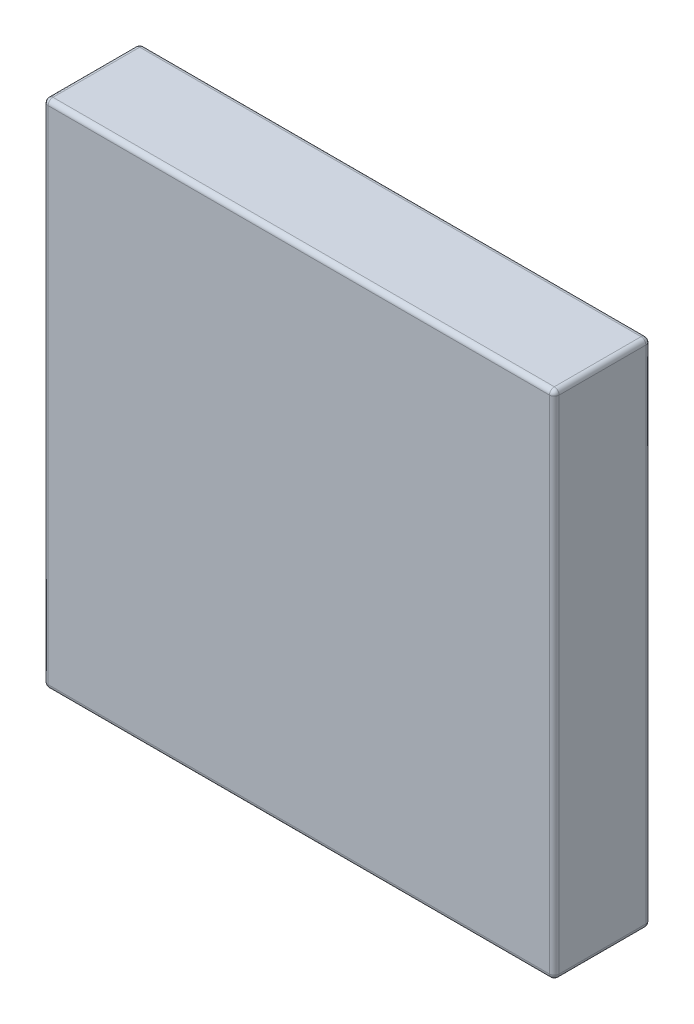
ISO-10303-21;
HEADER;
FILE_DESCRIPTION(('STEP AP214'),'2;1');
FILE_NAME('part.step','',(''),(''),'','','');
FILE_SCHEMA(('AUTOMOTIVE_DESIGN { 1 0 10303 214 1 1 1 1 }'));
ENDSEC;
DATA;
#1=APPLICATION_CONTEXT('core data for automotive mechanical design processes');
#2=APPLICATION_PROTOCOL_DEFINITION('international standard','automotive_design',2000,#1);
#3=PRODUCT_CONTEXT('',#1,'mechanical');
#4=PRODUCT('Part','Part','',(#3));
#5=PRODUCT_RELATED_PRODUCT_CATEGORY('part','',(#4));
#6=PRODUCT_DEFINITION_FORMATION('','',#4);
#7=PRODUCT_DEFINITION_CONTEXT('part definition',#1,'design');
#8=PRODUCT_DEFINITION('design','',#6,#7);
#9=PRODUCT_DEFINITION_SHAPE('','',#8);
#10=(LENGTH_UNIT() NAMED_UNIT(*) SI_UNIT(.MILLI.,.METRE.));
#11=(NAMED_UNIT(*) PLANE_ANGLE_UNIT() SI_UNIT($,.RADIAN.));
#12=(NAMED_UNIT(*) SI_UNIT($,.STERADIAN.) SOLID_ANGLE_UNIT());
#13=UNCERTAINTY_MEASURE_WITH_UNIT(LENGTH_MEASURE(1.E-05),#10,'distance_accuracy_value','');
#14=(GEOMETRIC_REPRESENTATION_CONTEXT(3) GLOBAL_UNCERTAINTY_ASSIGNED_CONTEXT((#13)) GLOBAL_UNIT_ASSIGNED_CONTEXT((#10,
#11,#12)) REPRESENTATION_CONTEXT('',''));
#15=CARTESIAN_POINT('',(0.,0.,0.));
#16=DIRECTION('',(0.,0.,1.));
#17=DIRECTION('',(1.,0.,0.));
#18=AXIS2_PLACEMENT_3D('',#15,#16,#17);
#19=CARTESIAN_POINT('',(53.0330085889911,0.,10.));
#20=DIRECTION('',(0.,1.,0.));
#21=DIRECTION('',(0.,0.,1.));
#22=AXIS2_PLACEMENT_3D('',#19,#20,#21);
#23=PLANE('',#22);
#24=DIRECTION('',(1.,0.,0.));
#25=VECTOR('',#24,1.);
#26=CARTESIAN_POINT('',(53.0330085889911,0.,9.5));
#27=LINE('',#26,#25);
#28=CARTESIAN_POINT('',(52.5330085889911,0.,9.5));
#29=VERTEX_POINT('',#28);
#30=CARTESIAN_POINT('',(0.5,0.,9.5));
#31=VERTEX_POINT('',#30);
#32=EDGE_CURVE('E134',#29,#31,#27,.F.);
#33=ORIENTED_EDGE('',*,*,#32,.T.);
#34=DIRECTION('',(0.,0.,-1.));
#35=VECTOR('',#34,1.);
#36=CARTESIAN_POINT('',(0.5,0.,10.));
#37=LINE('',#36,#35);
#38=CARTESIAN_POINT('',(0.5,0.,0.5));
#39=VERTEX_POINT('',#38);
#40=EDGE_CURVE('E130',#31,#39,#37,.T.);
#41=ORIENTED_EDGE('',*,*,#40,.T.);
#42=DIRECTION('',(1.,0.,0.));
#43=VECTOR('',#42,1.);
#44=CARTESIAN_POINT('',(53.0330085889911,0.,0.5));
#45=LINE('',#44,#43);
#46=CARTESIAN_POINT('',(52.5330085889911,0.,0.5));
#47=VERTEX_POINT('',#46);
#48=EDGE_CURVE('E125',#39,#47,#45,.T.);
#49=ORIENTED_EDGE('',*,*,#48,.T.);
#50=DIRECTION('',(0.,0.,-1.));
#51=VECTOR('',#50,1.);
#52=CARTESIAN_POINT('',(52.5330085889911,0.,10.));
#53=LINE('',#52,#51);
#54=EDGE_CURVE('E127',#47,#29,#53,.F.);
#55=ORIENTED_EDGE('',*,*,#54,.T.);
#56=EDGE_LOOP('',(#33,#41,#49,#55));
#57=FACE_BOUND('',#56,.T.);
#58=ADVANCED_FACE('F33',(#57),#23,.F.);
#59=CARTESIAN_POINT('',(53.033008588991,53.0330085889911,10.));
#60=DIRECTION('',(-1.,0.,0.));
#61=DIRECTION('',(0.,-1.,0.));
#62=AXIS2_PLACEMENT_3D('',#59,#60,#61);
#63=PLANE('',#62);
#64=DIRECTION('',(0.,1.,0.));
#65=VECTOR('',#64,1.);
#66=CARTESIAN_POINT('',(53.033008588991,53.0330085889911,0.5));
#67=LINE('',#66,#65);
#68=CARTESIAN_POINT('',(53.0330085889911,0.500000000000001,0.5));
#69=VERTEX_POINT('',#68);
#70=CARTESIAN_POINT('',(53.033008588991,52.5330085889911,0.5));
#71=VERTEX_POINT('',#70);
#72=EDGE_CURVE('E273',#69,#71,#67,.T.);
#73=ORIENTED_EDGE('',*,*,#72,.T.);
#74=DIRECTION('',(0.,0.,-1.));
#75=VECTOR('',#74,1.);
#76=CARTESIAN_POINT('',(53.033008588991,52.5330085889911,10.));
#77=LINE('',#76,#75);
#78=CARTESIAN_POINT('',(53.033008588991,52.5330085889911,9.5));
#79=VERTEX_POINT('',#78);
#80=EDGE_CURVE('E276',#71,#79,#77,.F.);
#81=ORIENTED_EDGE('',*,*,#80,.T.);
#82=DIRECTION('',(0.,1.,0.));
#83=VECTOR('',#82,1.);
#84=CARTESIAN_POINT('',(53.033008588991,53.0330085889911,9.5));
#85=LINE('',#84,#83);
#86=CARTESIAN_POINT('',(53.0330085889911,0.500000000000001,9.5));
#87=VERTEX_POINT('',#86);
#88=EDGE_CURVE('E271',#79,#87,#85,.F.);
#89=ORIENTED_EDGE('',*,*,#88,.T.);
#90=DIRECTION('',(0.,0.,-1.));
#91=VECTOR('',#90,1.);
#92=CARTESIAN_POINT('',(53.0330085889911,0.5,10.));
#93=LINE('',#92,#91);
#94=EDGE_CURVE('E269',#87,#69,#93,.T.);
#95=ORIENTED_EDGE('',*,*,#94,.T.);
#96=EDGE_LOOP('',(#73,#81,#89,#95));
#97=FACE_BOUND('',#96,.T.);
#98=ADVANCED_FACE('F309',(#97),#63,.F.);
#99=CARTESIAN_POINT('',(53.033008588991,53.0330085889911,10.));
#100=DIRECTION('',(0.,-1.,0.));
#101=DIRECTION('',(1.,0.,0.));
#102=AXIS2_PLACEMENT_3D('',#99,#100,#101);
#103=PLANE('',#102);
#104=DIRECTION('',(-1.,0.,0.));
#105=VECTOR('',#104,1.);
#106=CARTESIAN_POINT('',(0.,53.0330085889911,0.5));
#107=LINE('',#106,#105);
#108=CARTESIAN_POINT('',(52.533008588991,53.0330085889911,0.5));
#109=VERTEX_POINT('',#108);
#110=CARTESIAN_POINT('',(0.5,53.0330085889911,0.5));
#111=VERTEX_POINT('',#110);
#112=EDGE_CURVE('E281',#109,#111,#107,.T.);
#113=ORIENTED_EDGE('',*,*,#112,.T.);
#114=DIRECTION('',(0.,0.,-1.));
#115=VECTOR('',#114,1.);
#116=CARTESIAN_POINT('',(0.5,53.0330085889911,10.));
#117=LINE('',#116,#115);
#118=CARTESIAN_POINT('',(0.5,53.0330085889911,9.5));
#119=VERTEX_POINT('',#118);
#120=EDGE_CURVE('E218',#111,#119,#117,.F.);
#121=ORIENTED_EDGE('',*,*,#120,.T.);
#122=DIRECTION('',(-1.,0.,0.));
#123=VECTOR('',#122,1.);
#124=CARTESIAN_POINT('',(53.033008588991,53.0330085889911,9.5));
#125=LINE('',#124,#123);
#126=CARTESIAN_POINT('',(52.533008588991,53.0330085889911,9.5));
#127=VERTEX_POINT('',#126);
#128=EDGE_CURVE('E211',#119,#127,#125,.F.);
#129=ORIENTED_EDGE('',*,*,#128,.T.);
#130=DIRECTION('',(0.,0.,-1.));
#131=VECTOR('',#130,1.);
#132=CARTESIAN_POINT('',(52.533008588991,53.0330085889911,10.));
#133=LINE('',#132,#131);
#134=EDGE_CURVE('E278',#127,#109,#133,.T.);
#135=ORIENTED_EDGE('',*,*,#134,.T.);
#136=EDGE_LOOP('',(#113,#121,#129,#135));
#137=FACE_BOUND('',#136,.T.);
#138=ADVANCED_FACE('F285',(#137),#103,.F.);
#139=CARTESIAN_POINT('',(0.,0.,10.));
#140=DIRECTION('',(1.,0.,0.));
#141=DIRECTION('',(0.,0.,-1.));
#142=AXIS2_PLACEMENT_3D('',#139,#140,#141);
#143=PLANE('',#142);
#144=DIRECTION('',(0.,-1.,0.));
#145=VECTOR('',#144,1.);
#146=CARTESIAN_POINT('',(0.,0.,0.5));
#147=LINE('',#146,#145);
#148=CARTESIAN_POINT('',(0.,52.5330085889911,0.5));
#149=VERTEX_POINT('',#148);
#150=CARTESIAN_POINT('',(0.,0.5,0.5));
#151=VERTEX_POINT('',#150);
#152=EDGE_CURVE('E248',#149,#151,#147,.T.);
#153=ORIENTED_EDGE('',*,*,#152,.T.);
#154=DIRECTION('',(0.,0.,-1.));
#155=VECTOR('',#154,1.);
#156=CARTESIAN_POINT('',(0.,0.5,10.));
#157=LINE('',#156,#155);
#158=CARTESIAN_POINT('',(0.,0.5,9.5));
#159=VERTEX_POINT('',#158);
#160=EDGE_CURVE('E252',#151,#159,#157,.F.);
#161=ORIENTED_EDGE('',*,*,#160,.T.);
#162=DIRECTION('',(0.,-1.,0.));
#163=VECTOR('',#162,1.);
#164=CARTESIAN_POINT('',(0.,0.,9.5));
#165=LINE('',#164,#163);
#166=CARTESIAN_POINT('',(0.,52.5330085889911,9.5));
#167=VERTEX_POINT('',#166);
#168=EDGE_CURVE('E243',#159,#167,#165,.F.);
#169=ORIENTED_EDGE('',*,*,#168,.T.);
#170=DIRECTION('',(0.,0.,-1.));
#171=VECTOR('',#170,1.);
#172=CARTESIAN_POINT('',(0.,52.5330085889911,10.));
#173=LINE('',#172,#171);
#174=EDGE_CURVE('E249',#167,#149,#173,.T.);
#175=ORIENTED_EDGE('',*,*,#174,.T.);
#176=EDGE_LOOP('',(#153,#161,#169,#175));
#177=FACE_BOUND('',#176,.T.);
#178=ADVANCED_FACE('F253',(#177),#143,.F.);
#179=CARTESIAN_POINT('',(0.,0.,10.));
#180=DIRECTION('',(0.,0.,-1.));
#181=DIRECTION('',(-1.,0.,0.));
#182=AXIS2_PLACEMENT_3D('',#179,#180,#181);
#183=PLANE('',#182);
#184=DIRECTION('',(0.,-1.,0.));
#185=VECTOR('',#184,1.);
#186=CARTESIAN_POINT('',(0.5,0.,10.));
#187=LINE('',#186,#185);
#188=CARTESIAN_POINT('',(0.5,52.5330085889911,10.));
#189=VERTEX_POINT('',#188);
#190=CARTESIAN_POINT('',(0.5,0.5,10.));
#191=VERTEX_POINT('',#190);
#192=EDGE_CURVE('E215',#189,#191,#187,.T.);
#193=ORIENTED_EDGE('',*,*,#192,.T.);
#194=DIRECTION('',(1.,0.,0.));
#195=VECTOR('',#194,1.);
#196=CARTESIAN_POINT('',(0.,0.5,10.));
#197=LINE('',#196,#195);
#198=CARTESIAN_POINT('',(52.5330085889911,0.5,10.));
#199=VERTEX_POINT('',#198);
#200=EDGE_CURVE('E11',#191,#199,#197,.T.);
#201=ORIENTED_EDGE('',*,*,#200,.T.);
#202=DIRECTION('',(0.,1.,0.));
#203=VECTOR('',#202,1.);
#204=CARTESIAN_POINT('',(52.5330085889911,0.,10.));
#205=LINE('',#204,#203);
#206=CARTESIAN_POINT('',(52.533008588991,52.5330085889911,10.));
#207=VERTEX_POINT('',#206);
#208=EDGE_CURVE('E42',#199,#207,#205,.T.);
#209=ORIENTED_EDGE('',*,*,#208,.T.);
#210=DIRECTION('',(-1.,0.,0.));
#211=VECTOR('',#210,1.);
#212=CARTESIAN_POINT('',(0.,52.5330085889911,10.));
#213=LINE('',#212,#211);
#214=EDGE_CURVE('E213',#207,#189,#213,.T.);
#215=ORIENTED_EDGE('',*,*,#214,.T.);
#216=EDGE_LOOP('',(#193,#201,#209,#215));
#217=FACE_BOUND('',#216,.T.);
#218=ADVANCED_FACE('F293',(#217),#183,.F.);
#219=CARTESIAN_POINT('',(0.,0.,0.));
#220=DIRECTION('',(0.,0.,-1.));
#221=DIRECTION('',(-1.,0.,0.));
#222=AXIS2_PLACEMENT_3D('',#219,#220,#221);
#223=PLANE('',#222);
#224=DIRECTION('',(1.,0.,0.));
#225=VECTOR('',#224,1.);
#226=CARTESIAN_POINT('',(0.,0.5,0.));
#227=LINE('',#226,#225);
#228=CARTESIAN_POINT('',(52.5330085889911,0.5,0.));
#229=VERTEX_POINT('',#228);
#230=CARTESIAN_POINT('',(0.5,0.5,0.));
#231=VERTEX_POINT('',#230);
#232=EDGE_CURVE('E155',#229,#231,#227,.F.);
#233=ORIENTED_EDGE('',*,*,#232,.T.);
#234=DIRECTION('',(0.,-1.,0.));
#235=VECTOR('',#234,1.);
#236=CARTESIAN_POINT('',(0.5,53.0330085889911,0.));
#237=LINE('',#236,#235);
#238=CARTESIAN_POINT('',(0.5,52.5330085889911,0.));
#239=VERTEX_POINT('',#238);
#240=EDGE_CURVE('E266',#231,#239,#237,.F.);
#241=ORIENTED_EDGE('',*,*,#240,.T.);
#242=DIRECTION('',(-1.,0.,0.));
#243=VECTOR('',#242,1.);
#244=CARTESIAN_POINT('',(53.033008588991,52.5330085889911,0.));
#245=LINE('',#244,#243);
#246=CARTESIAN_POINT('',(52.533008588991,52.5330085889911,0.));
#247=VERTEX_POINT('',#246);
#248=EDGE_CURVE('E258',#239,#247,#245,.F.);
#249=ORIENTED_EDGE('',*,*,#248,.T.);
#250=DIRECTION('',(0.,1.,0.));
#251=VECTOR('',#250,1.);
#252=CARTESIAN_POINT('',(52.5330085889911,0.,0.));
#253=LINE('',#252,#251);
#254=EDGE_CURVE('E260',#247,#229,#253,.F.);
#255=ORIENTED_EDGE('',*,*,#254,.T.);
#256=EDGE_LOOP('',(#233,#241,#249,#255));
#257=FACE_BOUND('',#256,.T.);
#258=ADVANCED_FACE('F338',(#257),#223,.T.);
#259=CARTESIAN_POINT('',(52.533008588991,52.5330085889911,10.));
#260=DIRECTION('',(0.,0.,-1.));
#261=DIRECTION('',(-1.,0.,0.));
#262=AXIS2_PLACEMENT_3D('',#259,#260,#261);
#263=CYLINDRICAL_SURFACE('',#262,0.5);
#264=CARTESIAN_POINT('',(52.533008588991,52.5330085889911,9.5));
#265=DIRECTION('',(0.,0.,1.));
#266=DIRECTION('',(1.,0.,0.));
#267=AXIS2_PLACEMENT_3D('',#264,#265,#266);
#268=CIRCLE('',#267,0.5);
#269=EDGE_CURVE('E37',#79,#127,#268,.T.);
#270=ORIENTED_EDGE('',*,*,#269,.F.);
#271=ORIENTED_EDGE('',*,*,#80,.F.);
#272=CARTESIAN_POINT('',(52.533008588991,52.5330085889911,0.5));
#273=DIRECTION('',(0.,0.,-1.));
#274=DIRECTION('',(-1.,0.,0.));
#275=AXIS2_PLACEMENT_3D('',#272,#273,#274);
#276=CIRCLE('',#275,0.5);
#277=EDGE_CURVE('E190',#109,#71,#276,.T.);
#278=ORIENTED_EDGE('',*,*,#277,.F.);
#279=ORIENTED_EDGE('',*,*,#134,.F.);
#280=EDGE_LOOP('',(#270,#271,#278,#279));
#281=FACE_BOUND('',#280,.T.);
#282=ADVANCED_FACE('F35',(#281),#263,.T.);
#283=CARTESIAN_POINT('',(52.533008588991,52.5330085889911,9.5));
#284=DIRECTION('',(0.,0.,1.));
#285=DIRECTION('',(1.,0.,0.));
#286=AXIS2_PLACEMENT_3D('',#283,#284,#285);
#287=SPHERICAL_SURFACE('',#286,0.5);
#288=CARTESIAN_POINT('',(52.533008588991,52.5330085889911,9.5));
#289=DIRECTION('',(0.,1.,0.));
#290=DIRECTION('',(0.,0.,1.));
#291=AXIS2_PLACEMENT_3D('',#288,#289,#290);
#292=CIRCLE('',#291,0.5);
#293=EDGE_CURVE('E186',#79,#207,#292,.F.);
#294=ORIENTED_EDGE('',*,*,#293,.F.);
#295=ORIENTED_EDGE('',*,*,#269,.T.);
#296=CARTESIAN_POINT('',(52.533008588991,52.5330085889911,9.5));
#297=DIRECTION('',(1.,0.,0.));
#298=DIRECTION('',(0.,0.,-1.));
#299=AXIS2_PLACEMENT_3D('',#296,#297,#298);
#300=CIRCLE('',#299,0.5);
#301=EDGE_CURVE('E188',#207,#127,#300,.F.);
#302=ORIENTED_EDGE('',*,*,#301,.F.);
#303=EDGE_LOOP('',(#294,#295,#302));
#304=FACE_BOUND('',#303,.T.);
#305=ADVANCED_FACE('F202',(#304),#287,.T.);
#306=CARTESIAN_POINT('',(52.533008588991,52.5330085889911,0.5));
#307=DIRECTION('',(0.,0.,1.));
#308=DIRECTION('',(1.,0.,0.));
#309=AXIS2_PLACEMENT_3D('',#306,#307,#308);
#310=SPHERICAL_SURFACE('',#309,0.5);
#311=CARTESIAN_POINT('',(52.533008588991,52.5330085889911,0.5));
#312=DIRECTION('',(1.,0.,0.));
#313=DIRECTION('',(0.,0.,-1.));
#314=AXIS2_PLACEMENT_3D('',#311,#312,#313);
#315=CIRCLE('',#314,0.5);
#316=EDGE_CURVE('E181',#109,#247,#315,.F.);
#317=ORIENTED_EDGE('',*,*,#316,.F.);
#318=ORIENTED_EDGE('',*,*,#277,.T.);
#319=CARTESIAN_POINT('',(52.533008588991,52.5330085889911,0.5));
#320=DIRECTION('',(0.,1.,0.));
#321=DIRECTION('',(0.,0.,1.));
#322=AXIS2_PLACEMENT_3D('',#319,#320,#321);
#323=CIRCLE('',#322,0.5);
#324=EDGE_CURVE('E184',#247,#71,#323,.F.);
#325=ORIENTED_EDGE('',*,*,#324,.F.);
#326=EDGE_LOOP('',(#317,#318,#325));
#327=FACE_BOUND('',#326,.T.);
#328=ADVANCED_FACE('F370',(#327),#310,.T.);
#329=CARTESIAN_POINT('',(0.,52.5330085889911,9.5));
#330=DIRECTION('',(-1.,0.,0.));
#331=DIRECTION('',(0.,-1.,0.));
#332=AXIS2_PLACEMENT_3D('',#329,#330,#331);
#333=CYLINDRICAL_SURFACE('',#332,0.5);
#334=ORIENTED_EDGE('',*,*,#301,.T.);
#335=ORIENTED_EDGE('',*,*,#128,.F.);
#336=CARTESIAN_POINT('',(0.5,52.5330085889911,9.5));
#337=DIRECTION('',(-1.,0.,0.));
#338=DIRECTION('',(0.,-1.,0.));
#339=AXIS2_PLACEMENT_3D('',#336,#337,#338);
#340=CIRCLE('',#339,0.5);
#341=EDGE_CURVE('E175',#189,#119,#340,.T.);
#342=ORIENTED_EDGE('',*,*,#341,.F.);
#343=ORIENTED_EDGE('',*,*,#214,.F.);
#344=EDGE_LOOP('',(#334,#335,#342,#343));
#345=FACE_BOUND('',#344,.T.);
#346=ADVANCED_FACE('F209',(#345),#333,.T.);
#347=CARTESIAN_POINT('',(52.5330085889911,0.,9.5));
#348=DIRECTION('',(0.,1.,0.));
#349=DIRECTION('',(-1.,0.,0.));
#350=AXIS2_PLACEMENT_3D('',#347,#348,#349);
#351=CYLINDRICAL_SURFACE('',#350,0.5);
#352=ORIENTED_EDGE('',*,*,#293,.T.);
#353=ORIENTED_EDGE('',*,*,#208,.F.);
#354=CARTESIAN_POINT('',(52.5330085889911,0.5,9.5));
#355=DIRECTION('',(0.,-1.,0.));
#356=DIRECTION('',(0.,0.,-1.));
#357=AXIS2_PLACEMENT_3D('',#354,#355,#356);
#358=CIRCLE('',#357,0.5);
#359=EDGE_CURVE('E173',#87,#199,#358,.T.);
#360=ORIENTED_EDGE('',*,*,#359,.F.);
#361=ORIENTED_EDGE('',*,*,#88,.F.);
#362=EDGE_LOOP('',(#352,#353,#360,#361));
#363=FACE_BOUND('',#362,.T.);
#364=ADVANCED_FACE('F345',(#363),#351,.T.);
#365=CARTESIAN_POINT('',(52.5330085889911,0.5,10.));
#366=DIRECTION('',(0.,0.,-1.));
#367=DIRECTION('',(-1.,0.,0.));
#368=AXIS2_PLACEMENT_3D('',#365,#366,#367);
#369=CYLINDRICAL_SURFACE('',#368,0.5);
#370=CARTESIAN_POINT('',(52.5330085889911,0.5,0.5));
#371=DIRECTION('',(0.,0.,-1.));
#372=DIRECTION('',(-1.,0.,0.));
#373=AXIS2_PLACEMENT_3D('',#370,#371,#372);
#374=CIRCLE('',#373,0.5);
#375=EDGE_CURVE('E141',#69,#47,#374,.T.);
#376=ORIENTED_EDGE('',*,*,#375,.F.);
#377=ORIENTED_EDGE('',*,*,#94,.F.);
#378=CARTESIAN_POINT('',(52.5330085889911,0.5,9.5));
#379=DIRECTION('',(0.,0.,1.));
#380=DIRECTION('',(1.,0.,0.));
#381=AXIS2_PLACEMENT_3D('',#378,#379,#380);
#382=CIRCLE('',#381,0.5);
#383=EDGE_CURVE('E144',#29,#87,#382,.T.);
#384=ORIENTED_EDGE('',*,*,#383,.F.);
#385=ORIENTED_EDGE('',*,*,#54,.F.);
#386=EDGE_LOOP('',(#376,#377,#384,#385));
#387=FACE_BOUND('',#386,.T.);
#388=ADVANCED_FACE('F139',(#387),#369,.T.);
#389=CARTESIAN_POINT('',(52.533008588991,53.0330085889911,0.5));
#390=DIRECTION('',(0.,-1.,0.));
#391=DIRECTION('',(1.,0.,0.));
#392=AXIS2_PLACEMENT_3D('',#389,#390,#391);
#393=CYLINDRICAL_SURFACE('',#392,0.5);
#394=ORIENTED_EDGE('',*,*,#324,.T.);
#395=ORIENTED_EDGE('',*,*,#72,.F.);
#396=CARTESIAN_POINT('',(52.5330085889911,0.5,0.5));
#397=DIRECTION('',(0.,-1.,0.));
#398=DIRECTION('',(1.,0.,0.));
#399=AXIS2_PLACEMENT_3D('',#396,#397,#398);
#400=CIRCLE('',#399,0.5);
#401=EDGE_CURVE('E152',#229,#69,#400,.T.);
#402=ORIENTED_EDGE('',*,*,#401,.F.);
#403=ORIENTED_EDGE('',*,*,#254,.F.);
#404=EDGE_LOOP('',(#394,#395,#402,#403));
#405=FACE_BOUND('',#404,.T.);
#406=ADVANCED_FACE('F342',(#405),#393,.T.);
#407=CARTESIAN_POINT('',(53.033008588991,52.5330085889911,0.5));
#408=DIRECTION('',(1.,0.,0.));
#409=DIRECTION('',(0.,1.,0.));
#410=AXIS2_PLACEMENT_3D('',#407,#408,#409);
#411=CYLINDRICAL_SURFACE('',#410,0.5);
#412=ORIENTED_EDGE('',*,*,#316,.T.);
#413=ORIENTED_EDGE('',*,*,#248,.F.);
#414=CARTESIAN_POINT('',(0.5,52.5330085889911,0.5));
#415=DIRECTION('',(-1.,0.,0.));
#416=DIRECTION('',(0.,-1.,0.));
#417=AXIS2_PLACEMENT_3D('',#414,#415,#416);
#418=CIRCLE('',#417,0.5);
#419=EDGE_CURVE('E168',#111,#239,#418,.T.);
#420=ORIENTED_EDGE('',*,*,#419,.F.);
#421=ORIENTED_EDGE('',*,*,#112,.F.);
#422=EDGE_LOOP('',(#412,#413,#420,#421));
#423=FACE_BOUND('',#422,.T.);
#424=ADVANCED_FACE('F336',(#423),#411,.T.);
#425=CARTESIAN_POINT('',(0.5,52.5330085889911,10.));
#426=DIRECTION('',(0.,0.,-1.));
#427=DIRECTION('',(-1.,0.,0.));
#428=AXIS2_PLACEMENT_3D('',#425,#426,#427);
#429=CYLINDRICAL_SURFACE('',#428,0.5);
#430=CARTESIAN_POINT('',(0.5,52.5330085889911,9.5));
#431=DIRECTION('',(0.,0.,1.));
#432=DIRECTION('',(1.,0.,0.));
#433=AXIS2_PLACEMENT_3D('',#430,#431,#432);
#434=CIRCLE('',#433,0.5);
#435=EDGE_CURVE('E178',#119,#167,#434,.T.);
#436=ORIENTED_EDGE('',*,*,#435,.F.);
#437=ORIENTED_EDGE('',*,*,#120,.F.);
#438=CARTESIAN_POINT('',(0.5,52.5330085889911,0.5));
#439=DIRECTION('',(0.,0.,-1.));
#440=DIRECTION('',(-1.,0.,0.));
#441=AXIS2_PLACEMENT_3D('',#438,#439,#440);
#442=CIRCLE('',#441,0.5);
#443=EDGE_CURVE('E166',#149,#111,#442,.T.);
#444=ORIENTED_EDGE('',*,*,#443,.F.);
#445=ORIENTED_EDGE('',*,*,#174,.F.);
#446=EDGE_LOOP('',(#436,#437,#444,#445));
#447=FACE_BOUND('',#446,.T.);
#448=ADVANCED_FACE('F289',(#447),#429,.T.);
#449=CARTESIAN_POINT('',(0.5,52.5330085889911,9.5));
#450=DIRECTION('',(0.,0.,1.));
#451=DIRECTION('',(1.,0.,0.));
#452=AXIS2_PLACEMENT_3D('',#449,#450,#451);
#453=SPHERICAL_SURFACE('',#452,0.5);
#454=ORIENTED_EDGE('',*,*,#341,.T.);
#455=ORIENTED_EDGE('',*,*,#435,.T.);
#456=CARTESIAN_POINT('',(0.5,52.5330085889911,9.5));
#457=DIRECTION('',(0.,1.,0.));
#458=DIRECTION('',(0.,0.,1.));
#459=AXIS2_PLACEMENT_3D('',#456,#457,#458);
#460=CIRCLE('',#459,0.5);
#461=EDGE_CURVE('E158',#189,#167,#460,.F.);
#462=ORIENTED_EDGE('',*,*,#461,.F.);
#463=EDGE_LOOP('',(#454,#455,#462));
#464=FACE_BOUND('',#463,.T.);
#465=ADVANCED_FACE('F292',(#464),#453,.T.);
#466=CARTESIAN_POINT('',(52.5330085889911,0.5,9.5));
#467=DIRECTION('',(0.,0.,1.));
#468=DIRECTION('',(1.,0.,0.));
#469=AXIS2_PLACEMENT_3D('',#466,#467,#468);
#470=SPHERICAL_SURFACE('',#469,0.5);
#471=ORIENTED_EDGE('',*,*,#383,.T.);
#472=ORIENTED_EDGE('',*,*,#359,.T.);
#473=CARTESIAN_POINT('',(52.5330085889911,0.5,9.5));
#474=DIRECTION('',(1.,0.,0.));
#475=DIRECTION('',(0.,0.,-1.));
#476=AXIS2_PLACEMENT_3D('',#473,#474,#475);
#477=CIRCLE('',#476,0.5);
#478=EDGE_CURVE('E50',#29,#199,#477,.F.);
#479=ORIENTED_EDGE('',*,*,#478,.F.);
#480=EDGE_LOOP('',(#471,#472,#479));
#481=FACE_BOUND('',#480,.T.);
#482=ADVANCED_FACE('F347',(#481),#470,.T.);
#483=CARTESIAN_POINT('',(52.5330085889911,0.5,0.5));
#484=DIRECTION('',(0.,0.,1.));
#485=DIRECTION('',(1.,0.,0.));
#486=AXIS2_PLACEMENT_3D('',#483,#484,#485);
#487=SPHERICAL_SURFACE('',#486,0.5);
#488=ORIENTED_EDGE('',*,*,#401,.T.);
#489=ORIENTED_EDGE('',*,*,#375,.T.);
#490=CARTESIAN_POINT('',(52.5330085889911,0.5,0.5));
#491=DIRECTION('',(1.,0.,0.));
#492=DIRECTION('',(0.,0.,-1.));
#493=AXIS2_PLACEMENT_3D('',#490,#491,#492);
#494=CIRCLE('',#493,0.5);
#495=EDGE_CURVE('E149',#229,#47,#494,.F.);
#496=ORIENTED_EDGE('',*,*,#495,.F.);
#497=EDGE_LOOP('',(#488,#489,#496));
#498=FACE_BOUND('',#497,.T.);
#499=ADVANCED_FACE('F148',(#498),#487,.T.);
#500=CARTESIAN_POINT('',(0.5,52.5330085889911,0.5));
#501=DIRECTION('',(0.,0.,1.));
#502=DIRECTION('',(1.,0.,0.));
#503=AXIS2_PLACEMENT_3D('',#500,#501,#502);
#504=SPHERICAL_SURFACE('',#503,0.5);
#505=ORIENTED_EDGE('',*,*,#443,.T.);
#506=ORIENTED_EDGE('',*,*,#419,.T.);
#507=CARTESIAN_POINT('',(0.5,52.5330085889911,0.5));
#508=DIRECTION('',(0.,1.,0.));
#509=DIRECTION('',(0.,0.,1.));
#510=AXIS2_PLACEMENT_3D('',#507,#508,#509);
#511=CIRCLE('',#510,0.5);
#512=EDGE_CURVE('E156',#149,#239,#511,.F.);
#513=ORIENTED_EDGE('',*,*,#512,.F.);
#514=EDGE_LOOP('',(#505,#506,#513));
#515=FACE_BOUND('',#514,.T.);
#516=ADVANCED_FACE('F306',(#515),#504,.T.);
#517=CARTESIAN_POINT('',(0.5,0.,9.5));
#518=DIRECTION('',(0.,-1.,0.));
#519=DIRECTION('',(0.,0.,-1.));
#520=AXIS2_PLACEMENT_3D('',#517,#518,#519);
#521=CYLINDRICAL_SURFACE('',#520,0.5);
#522=ORIENTED_EDGE('',*,*,#461,.T.);
#523=ORIENTED_EDGE('',*,*,#168,.F.);
#524=CARTESIAN_POINT('',(0.5,0.5,9.5));
#525=DIRECTION('',(0.,-1.,0.));
#526=DIRECTION('',(0.,0.,-1.));
#527=AXIS2_PLACEMENT_3D('',#524,#525,#526);
#528=CIRCLE('',#527,0.5);
#529=EDGE_CURVE('E160',#191,#159,#528,.T.);
#530=ORIENTED_EDGE('',*,*,#529,.F.);
#531=ORIENTED_EDGE('',*,*,#192,.F.);
#532=EDGE_LOOP('',(#522,#523,#530,#531));
#533=FACE_BOUND('',#532,.T.);
#534=ADVANCED_FACE('F245',(#533),#521,.T.);
#535=CARTESIAN_POINT('',(0.,0.5,9.5));
#536=DIRECTION('',(1.,0.,0.));
#537=DIRECTION('',(0.,0.,-1.));
#538=AXIS2_PLACEMENT_3D('',#535,#536,#537);
#539=CYLINDRICAL_SURFACE('',#538,0.5);
#540=ORIENTED_EDGE('',*,*,#478,.T.);
#541=ORIENTED_EDGE('',*,*,#200,.F.);
#542=CARTESIAN_POINT('',(0.5,0.5,9.5));
#543=DIRECTION('',(-1.,0.,0.));
#544=DIRECTION('',(0.,0.,1.));
#545=AXIS2_PLACEMENT_3D('',#542,#543,#544);
#546=CIRCLE('',#545,0.5);
#547=EDGE_CURVE('E232',#31,#191,#546,.T.);
#548=ORIENTED_EDGE('',*,*,#547,.F.);
#549=ORIENTED_EDGE('',*,*,#32,.F.);
#550=EDGE_LOOP('',(#540,#541,#548,#549));
#551=FACE_BOUND('',#550,.T.);
#552=ADVANCED_FACE('F294',(#551),#539,.T.);
#553=CARTESIAN_POINT('',(53.0330085889911,0.5,0.5));
#554=DIRECTION('',(-1.,0.,0.));
#555=DIRECTION('',(0.,0.,1.));
#556=AXIS2_PLACEMENT_3D('',#553,#554,#555);
#557=CYLINDRICAL_SURFACE('',#556,0.5);
#558=ORIENTED_EDGE('',*,*,#495,.T.);
#559=ORIENTED_EDGE('',*,*,#48,.F.);
#560=CARTESIAN_POINT('',(0.5,0.5,0.5));
#561=DIRECTION('',(-1.,0.,0.));
#562=DIRECTION('',(0.,-1.,0.));
#563=AXIS2_PLACEMENT_3D('',#560,#561,#562);
#564=CIRCLE('',#563,0.5);
#565=EDGE_CURVE('E229',#231,#39,#564,.T.);
#566=ORIENTED_EDGE('',*,*,#565,.F.);
#567=ORIENTED_EDGE('',*,*,#232,.F.);
#568=EDGE_LOOP('',(#558,#559,#566,#567));
#569=FACE_BOUND('',#568,.T.);
#570=ADVANCED_FACE('F154',(#569),#557,.T.);
#571=CARTESIAN_POINT('',(0.5,0.,0.5));
#572=DIRECTION('',(0.,1.,0.));
#573=DIRECTION('',(0.,0.,1.));
#574=AXIS2_PLACEMENT_3D('',#571,#572,#573);
#575=CYLINDRICAL_SURFACE('',#574,0.5);
#576=ORIENTED_EDGE('',*,*,#512,.T.);
#577=ORIENTED_EDGE('',*,*,#240,.F.);
#578=CARTESIAN_POINT('',(0.5,0.5,0.5));
#579=DIRECTION('',(0.,-1.,0.));
#580=DIRECTION('',(0.,0.,-1.));
#581=AXIS2_PLACEMENT_3D('',#578,#579,#580);
#582=CIRCLE('',#581,0.5);
#583=EDGE_CURVE('E226',#151,#231,#582,.T.);
#584=ORIENTED_EDGE('',*,*,#583,.F.);
#585=ORIENTED_EDGE('',*,*,#152,.F.);
#586=EDGE_LOOP('',(#576,#577,#584,#585));
#587=FACE_BOUND('',#586,.T.);
#588=ADVANCED_FACE('F304',(#587),#575,.T.);
#589=CARTESIAN_POINT('',(0.5,0.5,9.5));
#590=DIRECTION('',(0.,0.,1.));
#591=DIRECTION('',(1.,0.,0.));
#592=AXIS2_PLACEMENT_3D('',#589,#590,#591);
#593=SPHERICAL_SURFACE('',#592,0.5);
#594=ORIENTED_EDGE('',*,*,#547,.T.);
#595=ORIENTED_EDGE('',*,*,#529,.T.);
#596=CARTESIAN_POINT('',(0.5,0.5,9.5));
#597=DIRECTION('',(0.,0.,1.));
#598=DIRECTION('',(1.,0.,0.));
#599=AXIS2_PLACEMENT_3D('',#596,#597,#598);
#600=CIRCLE('',#599,0.5);
#601=EDGE_CURVE('E224',#31,#159,#600,.F.);
#602=ORIENTED_EDGE('',*,*,#601,.F.);
#603=EDGE_LOOP('',(#594,#595,#602));
#604=FACE_BOUND('',#603,.T.);
#605=ADVANCED_FACE('F239',(#604),#593,.T.);
#606=CARTESIAN_POINT('',(0.5,0.5,0.5));
#607=DIRECTION('',(0.,0.,1.));
#608=DIRECTION('',(1.,0.,0.));
#609=AXIS2_PLACEMENT_3D('',#606,#607,#608);
#610=SPHERICAL_SURFACE('',#609,0.5);
#611=ORIENTED_EDGE('',*,*,#583,.T.);
#612=ORIENTED_EDGE('',*,*,#565,.T.);
#613=CARTESIAN_POINT('',(0.5,0.5,0.5));
#614=DIRECTION('',(0.,0.,-1.));
#615=DIRECTION('',(-1.,0.,0.));
#616=AXIS2_PLACEMENT_3D('',#613,#614,#615);
#617=CIRCLE('',#616,0.5);
#618=EDGE_CURVE('E222',#151,#39,#617,.F.);
#619=ORIENTED_EDGE('',*,*,#618,.F.);
#620=EDGE_LOOP('',(#611,#612,#619));
#621=FACE_BOUND('',#620,.T.);
#622=ADVANCED_FACE('F321',(#621),#610,.T.);
#623=CARTESIAN_POINT('',(0.5,0.5,10.));
#624=DIRECTION('',(0.,0.,-1.));
#625=DIRECTION('',(-1.,0.,0.));
#626=AXIS2_PLACEMENT_3D('',#623,#624,#625);
#627=CYLINDRICAL_SURFACE('',#626,0.5);
#628=ORIENTED_EDGE('',*,*,#601,.T.);
#629=ORIENTED_EDGE('',*,*,#160,.F.);
#630=ORIENTED_EDGE('',*,*,#618,.T.);
#631=ORIENTED_EDGE('',*,*,#40,.F.);
#632=EDGE_LOOP('',(#628,#629,#630,#631));
#633=FACE_BOUND('',#632,.T.);
#634=ADVANCED_FACE('F318',(#633),#627,.T.);
#635=CLOSED_SHELL('',(#58,#98,#138,#178,#218,#258,#282,#305,#328,#346,#364,#388,#406,#424,#448,
#465,#482,#499,#516,#534,#552,#570,#588,#605,#622,#634));
#636=MANIFOLD_SOLID_BREP('B2',#635);
#637=ADVANCED_BREP_SHAPE_REPRESENTATION('',(#18,#636),#14);
#638=SHAPE_DEFINITION_REPRESENTATION(#9,#637);
ENDSEC;
END-ISO-10303-21;
